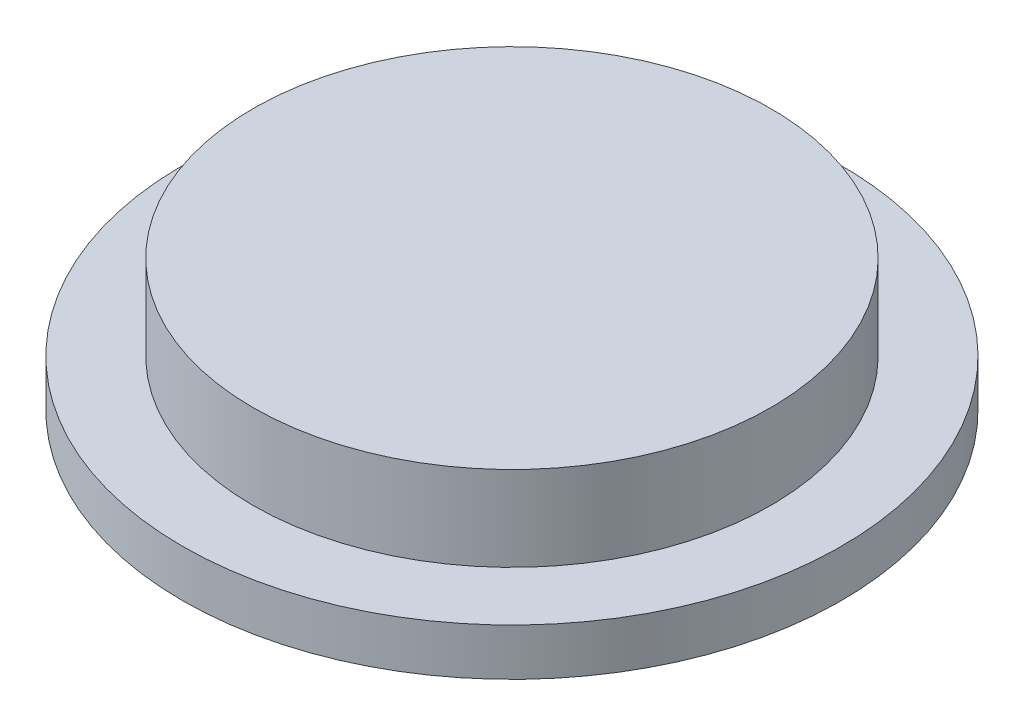
ISO-10303-21;
HEADER;
FILE_DESCRIPTION(('STEP AP214'),'2;1');
FILE_NAME('part.step','',(''),(''),'','','');
FILE_SCHEMA(('AUTOMOTIVE_DESIGN { 1 0 10303 214 1 1 1 1 }'));
ENDSEC;
DATA;
#1=APPLICATION_CONTEXT('core data for automotive mechanical design processes');
#2=APPLICATION_PROTOCOL_DEFINITION('international standard','automotive_design',2000,#1);
#3=PRODUCT_CONTEXT('',#1,'mechanical');
#4=PRODUCT('Part','Part','',(#3));
#5=PRODUCT_RELATED_PRODUCT_CATEGORY('part','',(#4));
#6=PRODUCT_DEFINITION_FORMATION('','',#4);
#7=PRODUCT_DEFINITION_CONTEXT('part definition',#1,'design');
#8=PRODUCT_DEFINITION('design','',#6,#7);
#9=PRODUCT_DEFINITION_SHAPE('','',#8);
#10=(LENGTH_UNIT() NAMED_UNIT(*) SI_UNIT(.MILLI.,.METRE.));
#11=(NAMED_UNIT(*) PLANE_ANGLE_UNIT() SI_UNIT($,.RADIAN.));
#12=(NAMED_UNIT(*) SI_UNIT($,.STERADIAN.) SOLID_ANGLE_UNIT());
#13=UNCERTAINTY_MEASURE_WITH_UNIT(LENGTH_MEASURE(1.E-05),#10,'distance_accuracy_value','');
#14=(GEOMETRIC_REPRESENTATION_CONTEXT(3) GLOBAL_UNCERTAINTY_ASSIGNED_CONTEXT((#13)) GLOBAL_UNIT_ASSIGNED_CONTEXT((#10,
#11,#12)) REPRESENTATION_CONTEXT('',''));
#15=CARTESIAN_POINT('',(0.,0.,0.));
#16=DIRECTION('',(0.,0.,1.));
#17=DIRECTION('',(1.,0.,0.));
#18=AXIS2_PLACEMENT_3D('',#15,#16,#17);
#19=CARTESIAN_POINT('',(0.,5.,0.));
#20=DIRECTION('',(0.,1.,0.));
#21=DIRECTION('',(0.,0.,1.));
#22=AXIS2_PLACEMENT_3D('',#19,#20,#21);
#23=PLANE('',#22);
#24=CARTESIAN_POINT('',(0.,5.,0.));
#25=DIRECTION('',(0.,1.,0.));
#26=DIRECTION('',(0.,0.,1.));
#27=AXIS2_PLACEMENT_3D('',#24,#25,#26);
#28=CIRCLE('',#27,27.5);
#29=CARTESIAN_POINT('',(0.,5.,27.5));
#30=VERTEX_POINT('',#29);
#31=EDGE_CURVE('E86',#30,#30,#28,.T.);
#32=ORIENTED_EDGE('',*,*,#31,.F.);
#33=EDGE_LOOP('',(#32));
#34=FACE_BOUND('',#33,.T.);
#35=CARTESIAN_POINT('',(0.,5.,0.));
#36=DIRECTION('',(0.,1.,0.));
#37=DIRECTION('',(0.,0.,1.));
#38=AXIS2_PLACEMENT_3D('',#35,#36,#37);
#39=CIRCLE('',#38,35.);
#40=CARTESIAN_POINT('',(0.,5.,35.));
#41=VERTEX_POINT('',#40);
#42=EDGE_CURVE('E10',#41,#41,#39,.T.);
#43=ORIENTED_EDGE('',*,*,#42,.T.);
#44=EDGE_LOOP('',(#43));
#45=FACE_BOUND('',#44,.T.);
#46=ADVANCED_FACE('F31',(#34,#45),#23,.T.);
#47=CARTESIAN_POINT('',(0.,0.,0.));
#48=DIRECTION('',(0.,1.,0.));
#49=DIRECTION('',(0.,0.,1.));
#50=AXIS2_PLACEMENT_3D('',#47,#48,#49);
#51=PLANE('',#50);
#52=CARTESIAN_POINT('',(0.,0.,0.));
#53=DIRECTION('',(0.,1.,0.));
#54=DIRECTION('',(0.,0.,1.));
#55=AXIS2_PLACEMENT_3D('',#52,#53,#54);
#56=CIRCLE('',#55,35.);
#57=CARTESIAN_POINT('',(0.,0.,35.));
#58=VERTEX_POINT('',#57);
#59=EDGE_CURVE('E35',#58,#58,#56,.T.);
#60=ORIENTED_EDGE('',*,*,#59,.F.);
#61=EDGE_LOOP('',(#60));
#62=FACE_BOUND('',#61,.T.);
#63=CARTESIAN_POINT('',(0.,0.,-25.5));
#64=DIRECTION('',(0.,1.,0.));
#65=DIRECTION('',(0.,0.,1.));
#66=AXIS2_PLACEMENT_3D('',#63,#64,#65);
#67=CIRCLE('',#66,1.5);
#68=CARTESIAN_POINT('',(0.,0.,-24.));
#69=VERTEX_POINT('',#68);
#70=EDGE_CURVE('E42',#69,#69,#67,.T.);
#71=ORIENTED_EDGE('',*,*,#70,.T.);
#72=EDGE_LOOP('',(#71));
#73=FACE_BOUND('',#72,.T.);
#74=CARTESIAN_POINT('',(0.,0.,0.));
#75=DIRECTION('',(0.,1.,0.));
#76=DIRECTION('',(0.,0.,1.));
#77=AXIS2_PLACEMENT_3D('',#74,#75,#76);
#78=CIRCLE('',#77,13.);
#79=CARTESIAN_POINT('',(0.,0.,13.));
#80=VERTEX_POINT('',#79);
#81=EDGE_CURVE('E46',#80,#80,#78,.T.);
#82=ORIENTED_EDGE('',*,*,#81,.T.);
#83=EDGE_LOOP('',(#82));
#84=FACE_BOUND('',#83,.T.);
#85=CARTESIAN_POINT('',(22.0836477965037,0.,-12.7500000000009));
#86=DIRECTION('',(0.,1.,0.));
#87=DIRECTION('',(0.,0.,1.));
#88=AXIS2_PLACEMENT_3D('',#85,#86,#87);
#89=CIRCLE('',#88,1.5000000000003);
#90=CARTESIAN_POINT('',(22.0836477965037,0.,-11.2500000000006));
#91=VERTEX_POINT('',#90);
#92=EDGE_CURVE('E49',#91,#91,#89,.T.);
#93=ORIENTED_EDGE('',*,*,#92,.T.);
#94=EDGE_LOOP('',(#93));
#95=FACE_BOUND('',#94,.T.);
#96=CARTESIAN_POINT('',(22.0836477965048,0.,12.7499999999991));
#97=DIRECTION('',(0.,1.,0.));
#98=DIRECTION('',(0.,0.,1.));
#99=AXIS2_PLACEMENT_3D('',#96,#97,#98);
#100=CIRCLE('',#99,1.5000000000014);
#101=CARTESIAN_POINT('',(22.0836477965048,0.,14.2500000000005));
#102=VERTEX_POINT('',#101);
#103=EDGE_CURVE('E52',#102,#102,#100,.T.);
#104=ORIENTED_EDGE('',*,*,#103,.T.);
#105=EDGE_LOOP('',(#104));
#106=FACE_BOUND('',#105,.T.);
#107=CARTESIAN_POINT('',(2.16489222341243E-12,0.,25.5));
#108=DIRECTION('',(0.,1.,0.));
#109=DIRECTION('',(0.,0.,1.));
#110=AXIS2_PLACEMENT_3D('',#107,#108,#109);
#111=CIRCLE('',#110,1.50000000000224);
#112=CARTESIAN_POINT('',(2.16489222341243E-12,0.,27.0000000000022));
#113=VERTEX_POINT('',#112);
#114=EDGE_CURVE('E55',#113,#113,#111,.T.);
#115=ORIENTED_EDGE('',*,*,#114,.T.);
#116=EDGE_LOOP('',(#115));
#117=FACE_BOUND('',#116,.T.);
#118=CARTESIAN_POINT('',(-22.0836477965016,0.,12.7500000000009));
#119=DIRECTION('',(0.,1.,0.));
#120=DIRECTION('',(0.,0.,1.));
#121=AXIS2_PLACEMENT_3D('',#118,#119,#120);
#122=CIRCLE('',#121,1.50000000000207);
#123=CARTESIAN_POINT('',(-22.0836477965016,0.,14.250000000003));
#124=VERTEX_POINT('',#123);
#125=EDGE_CURVE('E58',#124,#124,#122,.T.);
#126=ORIENTED_EDGE('',*,*,#125,.T.);
#127=EDGE_LOOP('',(#126));
#128=FACE_BOUND('',#127,.T.);
#129=CARTESIAN_POINT('',(-22.0836477965027,0.,-12.749999999999));
#130=DIRECTION('',(0.,1.,0.));
#131=DIRECTION('',(0.,0.,1.));
#132=AXIS2_PLACEMENT_3D('',#129,#130,#131);
#133=CIRCLE('',#132,1.5000000000011);
#134=CARTESIAN_POINT('',(-22.0836477965027,0.,-11.2499999999979));
#135=VERTEX_POINT('',#134);
#136=EDGE_CURVE('E61',#135,#135,#133,.T.);
#137=ORIENTED_EDGE('',*,*,#136,.T.);
#138=EDGE_LOOP('',(#137));
#139=FACE_BOUND('',#138,.T.);
#140=ADVANCED_FACE('F102',(#62,#73,#84,#95,#106,#117,#128,#139),#51,.F.);
#141=CARTESIAN_POINT('',(0.,5.,0.));
#142=DIRECTION('',(0.,-1.,0.));
#143=DIRECTION('',(0.,0.,-1.));
#144=AXIS2_PLACEMENT_3D('',#141,#142,#143);
#145=CYLINDRICAL_SURFACE('',#144,35.);
#146=ORIENTED_EDGE('',*,*,#42,.F.);
#147=EDGE_LOOP('',(#146));
#148=FACE_BOUND('',#147,.T.);
#149=ORIENTED_EDGE('',*,*,#59,.T.);
#150=EDGE_LOOP('',(#149));
#151=FACE_BOUND('',#150,.T.);
#152=ADVANCED_FACE('F33',(#148,#151),#145,.T.);
#153=CARTESIAN_POINT('',(0.,5.,-25.5));
#154=DIRECTION('',(0.,-1.,0.));
#155=DIRECTION('',(0.,0.,-1.));
#156=AXIS2_PLACEMENT_3D('',#153,#154,#155);
#157=CYLINDRICAL_SURFACE('',#156,1.5);
#158=CARTESIAN_POINT('',(0.,5.,-25.5));
#159=DIRECTION('',(0.,1.,0.));
#160=DIRECTION('',(0.,0.,1.));
#161=AXIS2_PLACEMENT_3D('',#158,#159,#160);
#162=CIRCLE('',#161,1.5);
#163=CARTESIAN_POINT('',(0.,5.,-24.));
#164=VERTEX_POINT('',#163);
#165=EDGE_CURVE('E64',#164,#164,#162,.T.);
#166=ORIENTED_EDGE('',*,*,#165,.T.);
#167=EDGE_LOOP('',(#166));
#168=FACE_BOUND('',#167,.T.);
#169=ORIENTED_EDGE('',*,*,#70,.F.);
#170=EDGE_LOOP('',(#169));
#171=FACE_BOUND('',#170,.T.);
#172=ADVANCED_FACE('F109',(#168,#171),#157,.F.);
#173=CARTESIAN_POINT('',(0.,5.,0.));
#174=DIRECTION('',(0.,-1.,0.));
#175=DIRECTION('',(0.,0.,-1.));
#176=AXIS2_PLACEMENT_3D('',#173,#174,#175);
#177=CYLINDRICAL_SURFACE('',#176,13.);
#178=CARTESIAN_POINT('',(0.,5.,0.));
#179=DIRECTION('',(0.,1.,0.));
#180=DIRECTION('',(0.,0.,1.));
#181=AXIS2_PLACEMENT_3D('',#178,#179,#180);
#182=CIRCLE('',#181,13.);
#183=CARTESIAN_POINT('',(0.,5.,13.));
#184=VERTEX_POINT('',#183);
#185=EDGE_CURVE('E67',#184,#184,#182,.T.);
#186=ORIENTED_EDGE('',*,*,#185,.T.);
#187=EDGE_LOOP('',(#186));
#188=FACE_BOUND('',#187,.T.);
#189=ORIENTED_EDGE('',*,*,#81,.F.);
#190=EDGE_LOOP('',(#189));
#191=FACE_BOUND('',#190,.T.);
#192=ADVANCED_FACE('F112',(#188,#191),#177,.F.);
#193=CARTESIAN_POINT('',(22.0836477965037,5.,-12.7500000000009));
#194=DIRECTION('',(0.,-1.,0.));
#195=DIRECTION('',(0.,0.,-1.));
#196=AXIS2_PLACEMENT_3D('',#193,#194,#195);
#197=CYLINDRICAL_SURFACE('',#196,1.5000000000003);
#198=CARTESIAN_POINT('',(22.0836477965037,5.,-12.7500000000009));
#199=DIRECTION('',(0.,1.,0.));
#200=DIRECTION('',(0.,0.,1.));
#201=AXIS2_PLACEMENT_3D('',#198,#199,#200);
#202=CIRCLE('',#201,1.5000000000003);
#203=CARTESIAN_POINT('',(22.0836477965037,5.,-11.2500000000006));
#204=VERTEX_POINT('',#203);
#205=EDGE_CURVE('E70',#204,#204,#202,.T.);
#206=ORIENTED_EDGE('',*,*,#205,.T.);
#207=EDGE_LOOP('',(#206));
#208=FACE_BOUND('',#207,.T.);
#209=ORIENTED_EDGE('',*,*,#92,.F.);
#210=EDGE_LOOP('',(#209));
#211=FACE_BOUND('',#210,.T.);
#212=ADVANCED_FACE('F116',(#208,#211),#197,.F.);
#213=CARTESIAN_POINT('',(22.0836477965048,5.,12.7499999999991));
#214=DIRECTION('',(0.,-1.,0.));
#215=DIRECTION('',(0.,0.,-1.));
#216=AXIS2_PLACEMENT_3D('',#213,#214,#215);
#217=CYLINDRICAL_SURFACE('',#216,1.5000000000014);
#218=CARTESIAN_POINT('',(22.0836477965048,5.,12.7499999999991));
#219=DIRECTION('',(0.,1.,0.));
#220=DIRECTION('',(0.,0.,1.));
#221=AXIS2_PLACEMENT_3D('',#218,#219,#220);
#222=CIRCLE('',#221,1.5000000000014);
#223=CARTESIAN_POINT('',(22.0836477965048,5.,14.2500000000005));
#224=VERTEX_POINT('',#223);
#225=EDGE_CURVE('E73',#224,#224,#222,.T.);
#226=ORIENTED_EDGE('',*,*,#225,.T.);
#227=EDGE_LOOP('',(#226));
#228=FACE_BOUND('',#227,.T.);
#229=ORIENTED_EDGE('',*,*,#103,.F.);
#230=EDGE_LOOP('',(#229));
#231=FACE_BOUND('',#230,.T.);
#232=ADVANCED_FACE('F120',(#228,#231),#217,.F.);
#233=CARTESIAN_POINT('',(2.16489222341243E-12,5.,25.5));
#234=DIRECTION('',(0.,-1.,0.));
#235=DIRECTION('',(0.,0.,-1.));
#236=AXIS2_PLACEMENT_3D('',#233,#234,#235);
#237=CYLINDRICAL_SURFACE('',#236,1.50000000000224);
#238=CARTESIAN_POINT('',(2.16489222341243E-12,5.,25.5));
#239=DIRECTION('',(0.,1.,0.));
#240=DIRECTION('',(0.,0.,1.));
#241=AXIS2_PLACEMENT_3D('',#238,#239,#240);
#242=CIRCLE('',#241,1.50000000000224);
#243=CARTESIAN_POINT('',(2.16489222341243E-12,5.,27.0000000000022));
#244=VERTEX_POINT('',#243);
#245=EDGE_CURVE('E76',#244,#244,#242,.T.);
#246=ORIENTED_EDGE('',*,*,#245,.T.);
#247=EDGE_LOOP('',(#246));
#248=FACE_BOUND('',#247,.T.);
#249=ORIENTED_EDGE('',*,*,#114,.F.);
#250=EDGE_LOOP('',(#249));
#251=FACE_BOUND('',#250,.T.);
#252=ADVANCED_FACE('F124',(#248,#251),#237,.F.);
#253=CARTESIAN_POINT('',(-22.0836477965016,5.,12.7500000000009));
#254=DIRECTION('',(0.,-1.,0.));
#255=DIRECTION('',(0.,0.,-1.));
#256=AXIS2_PLACEMENT_3D('',#253,#254,#255);
#257=CYLINDRICAL_SURFACE('',#256,1.50000000000207);
#258=CARTESIAN_POINT('',(-22.0836477965016,5.,12.7500000000009));
#259=DIRECTION('',(0.,1.,0.));
#260=DIRECTION('',(0.,0.,1.));
#261=AXIS2_PLACEMENT_3D('',#258,#259,#260);
#262=CIRCLE('',#261,1.50000000000207);
#263=CARTESIAN_POINT('',(-22.0836477965016,5.,14.250000000003));
#264=VERTEX_POINT('',#263);
#265=EDGE_CURVE('E79',#264,#264,#262,.T.);
#266=ORIENTED_EDGE('',*,*,#265,.T.);
#267=EDGE_LOOP('',(#266));
#268=FACE_BOUND('',#267,.T.);
#269=ORIENTED_EDGE('',*,*,#125,.F.);
#270=EDGE_LOOP('',(#269));
#271=FACE_BOUND('',#270,.T.);
#272=ADVANCED_FACE('F128',(#268,#271),#257,.F.);
#273=CARTESIAN_POINT('',(-22.0836477965027,5.,-12.749999999999));
#274=DIRECTION('',(0.,-1.,0.));
#275=DIRECTION('',(0.,0.,-1.));
#276=AXIS2_PLACEMENT_3D('',#273,#274,#275);
#277=CYLINDRICAL_SURFACE('',#276,1.5000000000011);
#278=CARTESIAN_POINT('',(-22.0836477965027,5.,-12.749999999999));
#279=DIRECTION('',(0.,1.,0.));
#280=DIRECTION('',(0.,0.,1.));
#281=AXIS2_PLACEMENT_3D('',#278,#279,#280);
#282=CIRCLE('',#281,1.5000000000011);
#283=CARTESIAN_POINT('',(-22.0836477965027,5.,-11.2499999999979));
#284=VERTEX_POINT('',#283);
#285=EDGE_CURVE('E82',#284,#284,#282,.T.);
#286=ORIENTED_EDGE('',*,*,#285,.T.);
#287=EDGE_LOOP('',(#286));
#288=FACE_BOUND('',#287,.T.);
#289=ORIENTED_EDGE('',*,*,#136,.F.);
#290=EDGE_LOOP('',(#289));
#291=FACE_BOUND('',#290,.T.);
#292=ADVANCED_FACE('F132',(#288,#291),#277,.F.);
#293=CARTESIAN_POINT('',(0.,5.,0.));
#294=DIRECTION('',(0.,1.,0.));
#295=DIRECTION('',(0.,0.,1.));
#296=AXIS2_PLACEMENT_3D('',#293,#294,#295);
#297=PLANE('',#296);
#298=ORIENTED_EDGE('',*,*,#285,.F.);
#299=EDGE_LOOP('',(#298));
#300=FACE_BOUND('',#299,.T.);
#301=ADVANCED_FACE('F135',(#300),#297,.F.);
#302=ORIENTED_EDGE('',*,*,#265,.F.);
#303=EDGE_LOOP('',(#302));
#304=FACE_BOUND('',#303,.T.);
#305=ADVANCED_FACE('F180',(#304),#297,.F.);
#306=ORIENTED_EDGE('',*,*,#245,.F.);
#307=EDGE_LOOP('',(#306));
#308=FACE_BOUND('',#307,.T.);
#309=ADVANCED_FACE('F173',(#308),#297,.F.);
#310=ORIENTED_EDGE('',*,*,#225,.F.);
#311=EDGE_LOOP('',(#310));
#312=FACE_BOUND('',#311,.T.);
#313=ADVANCED_FACE('F166',(#312),#297,.F.);
#314=ORIENTED_EDGE('',*,*,#205,.F.);
#315=EDGE_LOOP('',(#314));
#316=FACE_BOUND('',#315,.T.);
#317=ADVANCED_FACE('F159',(#316),#297,.F.);
#318=ORIENTED_EDGE('',*,*,#185,.F.);
#319=EDGE_LOOP('',(#318));
#320=FACE_BOUND('',#319,.T.);
#321=ADVANCED_FACE('F140',(#320),#297,.F.);
#322=ORIENTED_EDGE('',*,*,#165,.F.);
#323=EDGE_LOOP('',(#322));
#324=FACE_BOUND('',#323,.T.);
#325=ADVANCED_FACE('F97',(#324),#297,.F.);
#326=CARTESIAN_POINT('',(0.,14.,0.));
#327=DIRECTION('',(0.,-1.,0.));
#328=DIRECTION('',(0.,0.,-1.));
#329=AXIS2_PLACEMENT_3D('',#326,#327,#328);
#330=CYLINDRICAL_SURFACE('',#329,27.5);
#331=CARTESIAN_POINT('',(0.,14.,0.));
#332=DIRECTION('',(0.,1.,0.));
#333=DIRECTION('',(0.,0.,1.));
#334=AXIS2_PLACEMENT_3D('',#331,#332,#333);
#335=CIRCLE('',#334,27.5);
#336=CARTESIAN_POINT('',(0.,14.,27.5));
#337=VERTEX_POINT('',#336);
#338=EDGE_CURVE('E85',#337,#337,#335,.T.);
#339=ORIENTED_EDGE('',*,*,#338,.F.);
#340=EDGE_LOOP('',(#339));
#341=FACE_BOUND('',#340,.T.);
#342=ORIENTED_EDGE('',*,*,#31,.T.);
#343=EDGE_LOOP('',(#342));
#344=FACE_BOUND('',#343,.T.);
#345=ADVANCED_FACE('F94',(#341,#344),#330,.T.);
#346=CARTESIAN_POINT('',(0.,14.,0.));
#347=DIRECTION('',(0.,1.,0.));
#348=DIRECTION('',(0.,0.,1.));
#349=AXIS2_PLACEMENT_3D('',#346,#347,#348);
#350=PLANE('',#349);
#351=ORIENTED_EDGE('',*,*,#338,.T.);
#352=EDGE_LOOP('',(#351));
#353=FACE_BOUND('',#352,.T.);
#354=ADVANCED_FACE('F92',(#353),#350,.T.);
#355=CLOSED_SHELL('',(#46,#140,#152,#172,#192,#212,#232,#252,#272,#292,#301,#305,#309,#313,#317,
#321,#325,#345,#354));
#356=MANIFOLD_SOLID_BREP('B2',#355);
#357=ADVANCED_BREP_SHAPE_REPRESENTATION('',(#18,#356),#14);
#358=SHAPE_DEFINITION_REPRESENTATION(#9,#357);
ENDSEC;
END-ISO-10303-21;
